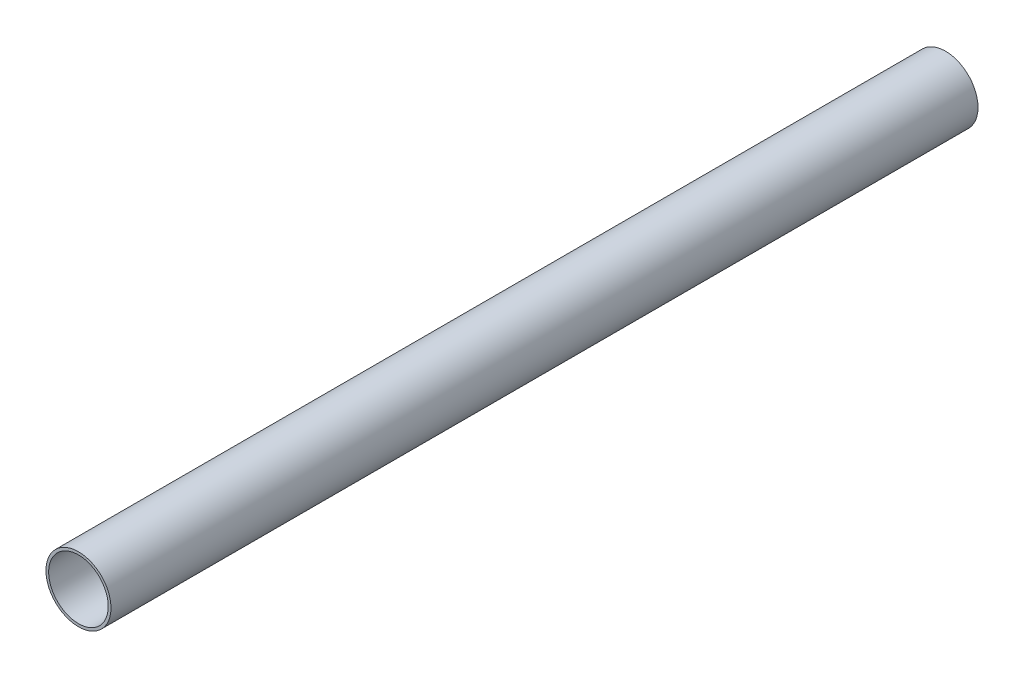
ISO-10303-21;
HEADER;
FILE_DESCRIPTION(('STEP AP214'),'2;1');
FILE_NAME('part.step','',(''),(''),'','','');
FILE_SCHEMA(('AUTOMOTIVE_DESIGN { 1 0 10303 214 1 1 1 1 }'));
ENDSEC;
DATA;
#1=APPLICATION_CONTEXT('core data for automotive mechanical design processes');
#2=APPLICATION_PROTOCOL_DEFINITION('international standard','automotive_design',2000,#1);
#3=PRODUCT_CONTEXT('',#1,'mechanical');
#4=PRODUCT('Part','Part','',(#3));
#5=PRODUCT_RELATED_PRODUCT_CATEGORY('part','',(#4));
#6=PRODUCT_DEFINITION_FORMATION('','',#4);
#7=PRODUCT_DEFINITION_CONTEXT('part definition',#1,'design');
#8=PRODUCT_DEFINITION('design','',#6,#7);
#9=PRODUCT_DEFINITION_SHAPE('','',#8);
#10=(LENGTH_UNIT() NAMED_UNIT(*) SI_UNIT(.MILLI.,.METRE.));
#11=(NAMED_UNIT(*) PLANE_ANGLE_UNIT() SI_UNIT($,.RADIAN.));
#12=(NAMED_UNIT(*) SI_UNIT($,.STERADIAN.) SOLID_ANGLE_UNIT());
#13=UNCERTAINTY_MEASURE_WITH_UNIT(LENGTH_MEASURE(1.E-05),#10,'distance_accuracy_value','');
#14=(GEOMETRIC_REPRESENTATION_CONTEXT(3) GLOBAL_UNCERTAINTY_ASSIGNED_CONTEXT((#13)) GLOBAL_UNIT_ASSIGNED_CONTEXT((#10,
#11,#12)) REPRESENTATION_CONTEXT('',''));
#15=CARTESIAN_POINT('',(0.,0.,0.));
#16=DIRECTION('',(0.,0.,1.));
#17=DIRECTION('',(1.,0.,0.));
#18=AXIS2_PLACEMENT_3D('',#15,#16,#17);
#19=CARTESIAN_POINT('',(0.,0.,320.));
#20=DIRECTION('',(0.,0.,1.));
#21=DIRECTION('',(1.,0.,0.));
#22=AXIS2_PLACEMENT_3D('',#19,#20,#21);
#23=PLANE('',#22);
#24=CARTESIAN_POINT('',(0.,0.,320.));
#25=DIRECTION('',(0.,0.,1.));
#26=DIRECTION('',(1.,0.,0.));
#27=AXIS2_PLACEMENT_3D('',#24,#25,#26);
#28=CIRCLE('',#27,12.);
#29=CARTESIAN_POINT('',(12.,0.,320.));
#30=VERTEX_POINT('',#29);
#31=EDGE_CURVE('E10',#30,#30,#28,.T.);
#32=ORIENTED_EDGE('',*,*,#31,.T.);
#33=EDGE_LOOP('',(#32));
#34=FACE_BOUND('',#33,.T.);
#35=CARTESIAN_POINT('',(0.,0.,320.));
#36=DIRECTION('',(0.,0.,1.));
#37=DIRECTION('',(1.,0.,0.));
#38=AXIS2_PLACEMENT_3D('',#35,#36,#37);
#39=CIRCLE('',#38,11.);
#40=CARTESIAN_POINT('',(11.,0.,320.));
#41=VERTEX_POINT('',#40);
#42=EDGE_CURVE('E45',#41,#41,#39,.T.);
#43=ORIENTED_EDGE('',*,*,#42,.F.);
#44=EDGE_LOOP('',(#43));
#45=FACE_BOUND('',#44,.T.);
#46=ADVANCED_FACE('F34',(#34,#45),#23,.T.);
#47=CARTESIAN_POINT('',(0.,0.,0.));
#48=DIRECTION('',(0.,0.,1.));
#49=DIRECTION('',(1.,0.,0.));
#50=AXIS2_PLACEMENT_3D('',#47,#48,#49);
#51=PLANE('',#50);
#52=CARTESIAN_POINT('',(0.,0.,0.));
#53=DIRECTION('',(0.,0.,1.));
#54=DIRECTION('',(1.,0.,0.));
#55=AXIS2_PLACEMENT_3D('',#52,#53,#54);
#56=CIRCLE('',#55,12.);
#57=CARTESIAN_POINT('',(12.,0.,0.));
#58=VERTEX_POINT('',#57);
#59=EDGE_CURVE('E38',#58,#58,#56,.T.);
#60=ORIENTED_EDGE('',*,*,#59,.F.);
#61=EDGE_LOOP('',(#60));
#62=FACE_BOUND('',#61,.T.);
#63=CARTESIAN_POINT('',(0.,0.,0.));
#64=DIRECTION('',(0.,0.,1.));
#65=DIRECTION('',(1.,0.,0.));
#66=AXIS2_PLACEMENT_3D('',#63,#64,#65);
#67=CIRCLE('',#66,11.);
#68=CARTESIAN_POINT('',(11.,0.,0.));
#69=VERTEX_POINT('',#68);
#70=EDGE_CURVE('E47',#69,#69,#67,.T.);
#71=ORIENTED_EDGE('',*,*,#70,.T.);
#72=EDGE_LOOP('',(#71));
#73=FACE_BOUND('',#72,.T.);
#74=ADVANCED_FACE('F57',(#62,#73),#51,.F.);
#75=CARTESIAN_POINT('',(0.,0.,320.));
#76=DIRECTION('',(0.,0.,-1.));
#77=DIRECTION('',(-1.,0.,0.));
#78=AXIS2_PLACEMENT_3D('',#75,#76,#77);
#79=CYLINDRICAL_SURFACE('',#78,12.);
#80=ORIENTED_EDGE('',*,*,#31,.F.);
#81=EDGE_LOOP('',(#80));
#82=FACE_BOUND('',#81,.T.);
#83=ORIENTED_EDGE('',*,*,#59,.T.);
#84=EDGE_LOOP('',(#83));
#85=FACE_BOUND('',#84,.T.);
#86=ADVANCED_FACE('F36',(#82,#85),#79,.T.);
#87=CARTESIAN_POINT('',(0.,0.,320.));
#88=DIRECTION('',(0.,0.,-1.));
#89=DIRECTION('',(-1.,0.,0.));
#90=AXIS2_PLACEMENT_3D('',#87,#88,#89);
#91=CYLINDRICAL_SURFACE('',#90,11.);
#92=ORIENTED_EDGE('',*,*,#42,.T.);
#93=EDGE_LOOP('',(#92));
#94=FACE_BOUND('',#93,.T.);
#95=ORIENTED_EDGE('',*,*,#70,.F.);
#96=EDGE_LOOP('',(#95));
#97=FACE_BOUND('',#96,.T.);
#98=ADVANCED_FACE('F53',(#94,#97),#91,.F.);
#99=CLOSED_SHELL('',(#46,#74,#86,#98));
#100=MANIFOLD_SOLID_BREP('B2',#99);
#101=ADVANCED_BREP_SHAPE_REPRESENTATION('',(#18,#100),#14);
#102=SHAPE_DEFINITION_REPRESENTATION(#9,#101);
ENDSEC;
END-ISO-10303-21;
